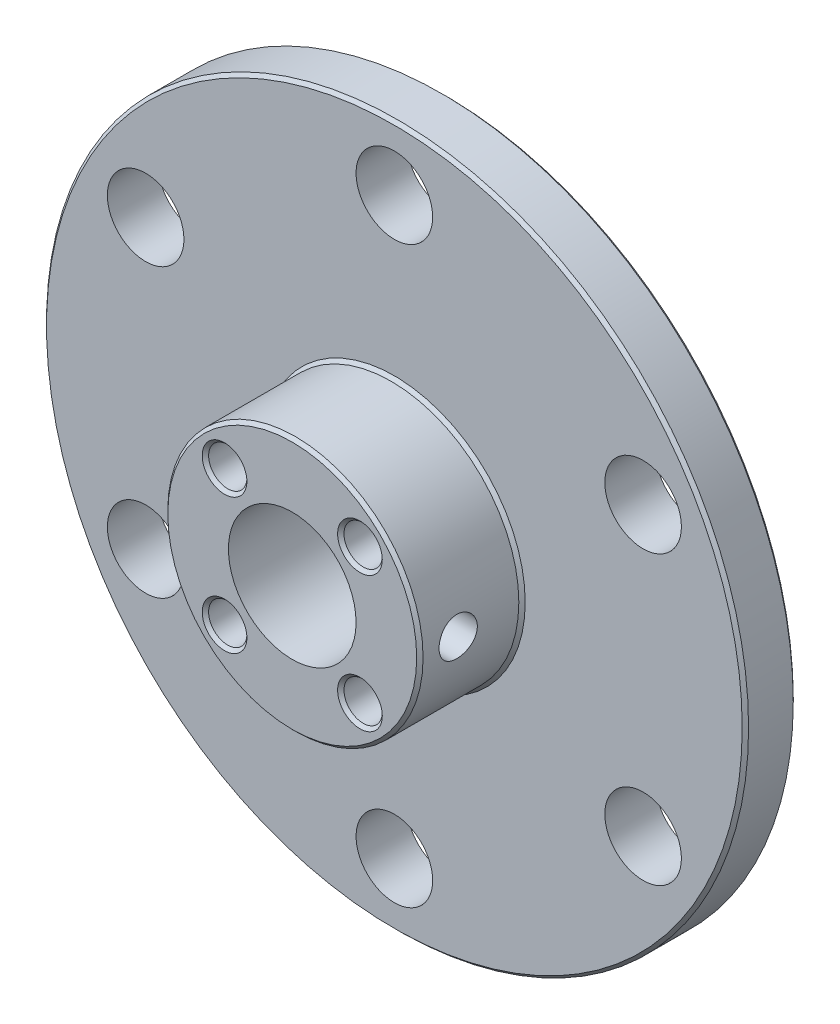
ISO-10303-21;
HEADER;
FILE_DESCRIPTION(('STEP AP214'),'2;1');
FILE_NAME('part.step','',(''),(''),'','','');
FILE_SCHEMA(('AUTOMOTIVE_DESIGN { 1 0 10303 214 1 1 1 1 }'));
ENDSEC;
DATA;
#1=APPLICATION_CONTEXT('core data for automotive mechanical design processes');
#2=APPLICATION_PROTOCOL_DEFINITION('international standard','automotive_design',2000,#1);
#3=PRODUCT_CONTEXT('',#1,'mechanical');
#4=PRODUCT('Part','Part','',(#3));
#5=PRODUCT_RELATED_PRODUCT_CATEGORY('part','',(#4));
#6=PRODUCT_DEFINITION_FORMATION('','',#4);
#7=PRODUCT_DEFINITION_CONTEXT('part definition',#1,'design');
#8=PRODUCT_DEFINITION('design','',#6,#7);
#9=PRODUCT_DEFINITION_SHAPE('','',#8);
#10=(LENGTH_UNIT() NAMED_UNIT(*) SI_UNIT(.MILLI.,.METRE.));
#11=(NAMED_UNIT(*) PLANE_ANGLE_UNIT() SI_UNIT($,.RADIAN.));
#12=(NAMED_UNIT(*) SI_UNIT($,.STERADIAN.) SOLID_ANGLE_UNIT());
#13=UNCERTAINTY_MEASURE_WITH_UNIT(LENGTH_MEASURE(1.E-05),#10,'distance_accuracy_value','');
#14=(GEOMETRIC_REPRESENTATION_CONTEXT(3) GLOBAL_UNCERTAINTY_ASSIGNED_CONTEXT((#13)) GLOBAL_UNIT_ASSIGNED_CONTEXT((#10,
#11,#12)) REPRESENTATION_CONTEXT('',''));
#15=CARTESIAN_POINT('',(0.,0.,0.));
#16=DIRECTION('',(0.,0.,1.));
#17=DIRECTION('',(1.,0.,0.));
#18=AXIS2_PLACEMENT_3D('',#15,#16,#17);
#19=CARTESIAN_POINT('',(0.,0.,12.));
#20=DIRECTION('',(0.,0.,-1.));
#21=DIRECTION('',(-1.,0.,0.));
#22=AXIS2_PLACEMENT_3D('',#19,#20,#21);
#23=CYLINDRICAL_SURFACE('',#22,10.);
#24=CARTESIAN_POINT('',(0.,0.,4.25000000000002));
#25=DIRECTION('',(0.,0.,1.));
#26=DIRECTION('',(1.,0.,0.));
#27=AXIS2_PLACEMENT_3D('',#24,#25,#26);
#28=CIRCLE('',#27,10.);
#29=CARTESIAN_POINT('',(10.,0.,4.25000000000002));
#30=VERTEX_POINT('',#29);
#31=EDGE_CURVE('E53',#30,#30,#28,.T.);
#32=ORIENTED_EDGE('',*,*,#31,.T.);
#33=EDGE_LOOP('',(#32));
#34=FACE_BOUND('',#33,.T.);
#35=CARTESIAN_POINT('',(0.,0.,11.75));
#36=DIRECTION('',(0.,0.,1.));
#37=DIRECTION('',(1.,0.,0.));
#38=AXIS2_PLACEMENT_3D('',#35,#36,#37);
#39=CIRCLE('',#38,10.);
#40=CARTESIAN_POINT('',(10.,0.,11.75));
#41=VERTEX_POINT('',#40);
#42=EDGE_CURVE('E58',#41,#41,#39,.F.);
#43=ORIENTED_EDGE('',*,*,#42,.T.);
#44=EDGE_LOOP('',(#43));
#45=FACE_BOUND('',#44,.T.);
#46=CARTESIAN_POINT('',(10.,0.,7.5));
#47=CARTESIAN_POINT('',(9.99999865771297,-0.083751544481642,7.50000345381524));
#48=CARTESIAN_POINT('',(9.9989368253704,-0.167551685082131,7.50703800084064));
#49=CARTESIAN_POINT('',(9.99480315973187,-0.332809627994913,7.53498319998275));
#50=CARTESIAN_POINT('',(9.99172936938473,-0.414265068974229,7.55590736294489));
#51=CARTESIAN_POINT('',(9.98391721219526,-0.57241808622186,7.61099250496763));
#52=CARTESIAN_POINT('',(9.97918010370919,-0.649119207826798,7.64514347950595));
#53=CARTESIAN_POINT('',(9.96856475911724,-0.795690428635253,7.72568837941686));
#54=CARTESIAN_POINT('',(9.96268668152773,-0.865561474725188,7.77208060441736));
#55=CARTESIAN_POINT('',(9.95039170991452,-0.997046719562126,7.87617726493988));
#56=CARTESIAN_POINT('',(9.94397133890331,-1.0585998322255,7.9339584562082));
#57=CARTESIAN_POINT('',(9.93134261133238,-1.17117490668948,8.05902768889387));
#58=CARTESIAN_POINT('',(9.92513426698505,-1.22219626272936,8.12631627677852));
#59=CARTESIAN_POINT('',(9.91359877458726,-1.31249729499943,8.26890064352249));
#60=CARTESIAN_POINT('',(9.90827611975031,-1.35171787037205,8.34423424698134));
#61=CARTESIAN_POINT('',(9.89916211306268,-1.41692632171056,8.50051282064543));
#62=CARTESIAN_POINT('',(9.89537067775449,-1.44291491889163,8.5814574847439));
#63=CARTESIAN_POINT('',(9.88978256218673,-1.48073198798911,8.74601804187172));
#64=CARTESIAN_POINT('',(9.8879711574125,-1.49266503640518,8.82960939340803));
#65=CARTESIAN_POINT('',(9.88650348970582,-1.50235624033932,8.99762616598728));
#66=CARTESIAN_POINT('',(9.88684710303147,-1.50011520973796,9.0820515388625));
#67=CARTESIAN_POINT('',(9.88963718352409,-1.48160733250787,9.24860108019414));
#68=CARTESIAN_POINT('',(9.89206618761549,-1.4654569592775,9.3307385264848));
#69=CARTESIAN_POINT('',(9.89872608126367,-1.41977117403734,9.49112436887153));
#70=CARTESIAN_POINT('',(9.90295702179379,-1.39023538337812,9.56937265488075));
#71=CARTESIAN_POINT('',(9.91276335545481,-1.31849603529736,9.72011337128286));
#72=CARTESIAN_POINT('',(9.91834396766526,-1.27624314283198,9.79258196909239));
#73=CARTESIAN_POINT('',(9.93021707574548,-1.18030413128955,9.92944459578193));
#74=CARTESIAN_POINT('',(9.93650961832501,-1.12661726182478,9.99383809426937));
#75=CARTESIAN_POINT('',(9.94917473056209,-1.00869493078248,10.1133976607397));
#76=CARTESIAN_POINT('',(9.95554747112815,-0.944359329642002,10.1684649902863));
#77=CARTESIAN_POINT('',(9.96759647648462,-0.807307089894186,10.2670359345073));
#78=CARTESIAN_POINT('',(9.9732727382251,-0.73459041458817,10.3105394985439));
#79=CARTESIAN_POINT('',(9.98329515585393,-0.582754598213686,10.3847530864995));
#80=CARTESIAN_POINT('',(9.98764051925428,-0.50363167783678,10.4154554918403));
#81=CARTESIAN_POINT('',(9.99450490557069,-0.341273182487061,10.4631093896854));
#82=CARTESIAN_POINT('',(9.99702405195467,-0.258037885952601,10.4800618118156));
#83=CARTESIAN_POINT('',(9.99993581133871,-0.0906695676436468,10.4996032298167));
#84=CARTESIAN_POINT('',(10.0003485209039,-0.00655273187047065,10.5023279713793));
#85=CARTESIAN_POINT('',(9.99905561015226,0.160936677662283,10.493696994689));
#86=CARTESIAN_POINT('',(9.99735005541369,0.244309274381877,10.4823417123319));
#87=CARTESIAN_POINT('',(9.99202468615333,0.407532387431408,10.4459858998225));
#88=CARTESIAN_POINT('',(9.98841415207984,0.487397963079838,10.4210515039692));
#89=CARTESIAN_POINT('',(9.97968235658369,0.641814958642999,10.3583150025382));
#90=CARTESIAN_POINT('',(9.97456102421565,0.716366128795099,10.3205122926664));
#91=CARTESIAN_POINT('',(9.96332682468686,0.85863497929192,10.2327937754361));
#92=CARTESIAN_POINT('',(9.95720701626745,0.926299009891565,10.1827918599872));
#93=CARTESIAN_POINT('',(9.94467863012165,1.0523236731777,10.0722141883713));
#94=CARTESIAN_POINT('',(9.93827003562867,1.1106837647934,10.0116378176754));
#95=CARTESIAN_POINT('',(9.92582264304494,1.21693784957195,9.88102646682351));
#96=CARTESIAN_POINT('',(9.91978736017588,1.26474084747421,9.81091707480523));
#97=CARTESIAN_POINT('',(9.90883219104903,1.34789129270584,9.66358395948823));
#98=CARTESIAN_POINT('',(9.90391227465628,1.38323907656436,9.58636042847854));
#99=CARTESIAN_POINT('',(9.89577033008645,1.44033467323943,9.42726246637687));
#100=CARTESIAN_POINT('',(9.89254233006438,1.46213037141635,9.34540553902876));
#101=CARTESIAN_POINT('',(9.88813382297802,1.49165549501586,9.1791409845649));
#102=CARTESIAN_POINT('',(9.88695317451771,1.49938589183066,9.09473353400533));
#103=CARTESIAN_POINT('',(9.88677832610841,1.5005378666944,8.92667093668422));
#104=CARTESIAN_POINT('',(9.88776226333502,1.49410252167313,8.84301675824308));
#105=CARTESIAN_POINT('',(9.89175820611174,1.46741229544379,8.67799473667649));
#106=CARTESIAN_POINT('',(9.89477020841118,1.44715743638627,8.59662688988661));
#107=CARTESIAN_POINT('',(9.90247526112297,1.39345373518665,8.43852691776568));
#108=CARTESIAN_POINT('',(9.90716703716075,1.36001489324314,8.36179132956657));
#109=CARTESIAN_POINT('',(9.91770454557702,1.28090667642309,8.2149963661976));
#110=CARTESIAN_POINT('',(9.92355031702724,1.23523688741502,8.14493721719636));
#111=CARTESIAN_POINT('',(9.93580743364938,1.13244337659164,8.01275694202483));
#112=CARTESIAN_POINT('',(9.94222367881967,1.07521369039806,7.95071866675293));
#113=CARTESIAN_POINT('',(9.95485788826636,0.951148841082834,7.83707544521218));
#114=CARTESIAN_POINT('',(9.96107580610759,0.884311448350941,7.78547292742384));
#115=CARTESIAN_POINT('',(9.9726518579052,0.742495707543722,7.69391232339264));
#116=CARTESIAN_POINT('',(9.9780050712882,0.667474576764761,7.65401989078526));
#117=CARTESIAN_POINT('',(9.98720028802959,0.51175187024872,7.58746148324196));
#118=CARTESIAN_POINT('',(9.99104385565757,0.431056277096705,7.56078180994631));
#119=CARTESIAN_POINT('',(9.99590939261505,0.29166572788933,7.52745865728989));
#120=CARTESIAN_POINT('',(9.99743549179557,0.233831133495279,7.51717739846119));
#121=CARTESIAN_POINT('',(9.99948125947896,0.117338971600125,7.50344690228736));
#122=CARTESIAN_POINT('',(10.0000009404877,0.0586814143344172,7.49999758004746));
#123=CARTESIAN_POINT('',(10.,0.,7.5));
#124=B_SPLINE_CURVE_WITH_KNOTS('',3,(#46,#47,#48,#49,#50,#51,#52,#53,#54,#55,#56,#57,#58,#59,
#60,#61,#62,#63,#64,#65,#66,#67,#68,#69,#70,#71,#72,#73,#74,#75,#76,#77,#78,#79,#80,#81,#82,#83,
#84,#85,#86,#87,#88,#89,#90,#91,#92,#93,#94,#95,#96,#97,#98,#99,#100,#101,#102,#103,#104,#105,
#106,#107,#108,#109,#110,#111,#112,#113,#114,#115,#116,#117,#118,#119,#120,#121,#122,#123),
.UNSPECIFIED.,.T.,.F.,(4,2,2,2,2,2,2,2,2,2,2,2,2,2,2,2,2,2,2,2,2,2,2,2,2,2,2,2,2,2,2,2,2,2,2,2,
2,2,4),(0.,0.251040205031663,0.50232496292915,0.753420023583236,1.0044802241976,
1.25729416136843,1.5101226357258,1.76419702395375,2.01825756225506,2.27041564605924,
2.52255925098982,2.77261177195746,3.02267136690361,3.27371383476159,3.52477278308534,
3.77834291255408,4.03191415238668,4.28563608984874,4.53934087193401,4.79062058544255,
5.04189251991155,5.29195148965948,5.54202220376273,5.79391188036907,6.04581620028629,
6.29981366584671,6.55380426808832,6.80689223457168,7.05996272137176,7.31048888261064,
7.56101464229563,7.81135073984146,8.06169531466879,8.3144482996572,8.56726003468733,
8.82146323384733,9.07540233261441,9.25129851978808,9.4271925212329),.UNSPECIFIED.);
#125=CARTESIAN_POINT('',(10.,0.,7.5));
#126=VERTEX_POINT('',#125);
#127=EDGE_CURVE('E119',#126,#126,#124,.T.);
#128=ORIENTED_EDGE('',*,*,#127,.T.);
#129=EDGE_LOOP('',(#128));
#130=FACE_BOUND('',#129,.T.);
#131=CARTESIAN_POINT('',(-10.,0.,10.5));
#132=CARTESIAN_POINT('',(-9.99999865771297,0.0837515444816421,10.4999965461848));
#133=CARTESIAN_POINT('',(-9.9989368253704,0.167551685082132,10.4929619991594));
#134=CARTESIAN_POINT('',(-9.99480315973187,0.332809627994913,10.4650168000172));
#135=CARTESIAN_POINT('',(-9.99172936938473,0.414265068974229,10.4440926370551));
#136=CARTESIAN_POINT('',(-9.98391721219526,0.572418086221859,10.3890074950324));
#137=CARTESIAN_POINT('',(-9.97918010370919,0.649119207826798,10.3548565204941));
#138=CARTESIAN_POINT('',(-9.96856475911724,0.795690428635253,10.2743116205831));
#139=CARTESIAN_POINT('',(-9.96268668152773,0.865561474725188,10.2279193955826));
#140=CARTESIAN_POINT('',(-9.95039170991452,0.997046719562126,10.1238227350601));
#141=CARTESIAN_POINT('',(-9.94397133890331,1.0585998322255,10.0660415437918));
#142=CARTESIAN_POINT('',(-9.93134261133238,1.17117490668948,9.94097231110613));
#143=CARTESIAN_POINT('',(-9.92513426698505,1.22219626272936,9.87368372322148));
#144=CARTESIAN_POINT('',(-9.91359877458726,1.31249729499943,9.73109935647751));
#145=CARTESIAN_POINT('',(-9.90827611975031,1.35171787037205,9.65576575301866));
#146=CARTESIAN_POINT('',(-9.89916211306268,1.41692632171056,9.49948717935457));
#147=CARTESIAN_POINT('',(-9.89537067775449,1.44291491889163,9.41854251525611));
#148=CARTESIAN_POINT('',(-9.88978256218673,1.48073198798911,9.25398195812828));
#149=CARTESIAN_POINT('',(-9.8879711574125,1.49266503640518,9.17039060659198));
#150=CARTESIAN_POINT('',(-9.88650348970582,1.50235624033932,9.00237383401272));
#151=CARTESIAN_POINT('',(-9.88684710303147,1.50011520973796,8.91794846113751));
#152=CARTESIAN_POINT('',(-9.88963718352409,1.48160733250787,8.75139891980586));
#153=CARTESIAN_POINT('',(-9.89206618761549,1.4654569592775,8.6692614735152));
#154=CARTESIAN_POINT('',(-9.89872608126367,1.41977117403734,8.50887563112847));
#155=CARTESIAN_POINT('',(-9.90295702179379,1.39023538337812,8.43062734511926));
#156=CARTESIAN_POINT('',(-9.91276335545481,1.31849603529736,8.27988662871714));
#157=CARTESIAN_POINT('',(-9.91834396766526,1.27624314283198,8.20741803090761));
#158=CARTESIAN_POINT('',(-9.93021707574548,1.18030413128955,8.07055540421807));
#159=CARTESIAN_POINT('',(-9.93650961832501,1.12661726182478,8.00616190573063));
#160=CARTESIAN_POINT('',(-9.94917473056209,1.00869493078248,7.88660233926029));
#161=CARTESIAN_POINT('',(-9.95554747112815,0.944359329642002,7.83153500971366));
#162=CARTESIAN_POINT('',(-9.96759647648462,0.807307089894187,7.73296406549274));
#163=CARTESIAN_POINT('',(-9.9732727382251,0.734590414588171,7.68946050145611));
#164=CARTESIAN_POINT('',(-9.98329515585393,0.582754598213686,7.61524691350046));
#165=CARTESIAN_POINT('',(-9.98764051925428,0.50363167783678,7.58454450815971));
#166=CARTESIAN_POINT('',(-9.99450490557069,0.341273182487061,7.53689061031463));
#167=CARTESIAN_POINT('',(-9.99702405195467,0.2580378859526,7.51993818818443));
#168=CARTESIAN_POINT('',(-9.99993581133871,0.0906695676436462,7.50039677018331));
#169=CARTESIAN_POINT('',(-10.0003485209039,0.00655273187047014,7.49767202862068));
#170=CARTESIAN_POINT('',(-9.99905561015226,-0.160936677662283,7.50630300531103));
#171=CARTESIAN_POINT('',(-9.99735005541369,-0.244309274381877,7.5176582876681));
#172=CARTESIAN_POINT('',(-9.99202468615333,-0.407532387431408,7.55401410017754));
#173=CARTESIAN_POINT('',(-9.98841415207984,-0.487397963079838,7.57894849603085));
#174=CARTESIAN_POINT('',(-9.97968235658369,-0.641814958642999,7.64168499746176));
#175=CARTESIAN_POINT('',(-9.97456102421565,-0.7163661287951,7.67948770733363));
#176=CARTESIAN_POINT('',(-9.96332682468686,-0.858634979291921,7.76720622456386));
#177=CARTESIAN_POINT('',(-9.95720701626745,-0.926299009891566,7.81720814001277));
#178=CARTESIAN_POINT('',(-9.94467863012165,-1.05232367317771,7.92778581162875));
#179=CARTESIAN_POINT('',(-9.93827003562867,-1.1106837647934,7.98836218232465));
#180=CARTESIAN_POINT('',(-9.92582264304494,-1.21693784957195,8.11897353317649));
#181=CARTESIAN_POINT('',(-9.91978736017588,-1.26474084747421,8.18908292519477));
#182=CARTESIAN_POINT('',(-9.90883219104903,-1.34789129270584,8.33641604051177));
#183=CARTESIAN_POINT('',(-9.90391227465628,-1.38323907656436,8.41363957152147));
#184=CARTESIAN_POINT('',(-9.89577033008645,-1.44033467323943,8.57273753362313));
#185=CARTESIAN_POINT('',(-9.89254233006438,-1.46213037141635,8.65459446097124));
#186=CARTESIAN_POINT('',(-9.88813382297802,-1.49165549501586,8.82085901543511));
#187=CARTESIAN_POINT('',(-9.88695317451771,-1.49938589183066,8.90526646599467));
#188=CARTESIAN_POINT('',(-9.88677832610841,-1.5005378666944,9.07332906331578));
#189=CARTESIAN_POINT('',(-9.88776226333502,-1.49410252167313,9.15698324175692));
#190=CARTESIAN_POINT('',(-9.89175820611174,-1.46741229544379,9.32200526332352));
#191=CARTESIAN_POINT('',(-9.89477020841118,-1.44715743638627,9.40337311011339));
#192=CARTESIAN_POINT('',(-9.90247526112297,-1.39345373518665,9.56147308223432));
#193=CARTESIAN_POINT('',(-9.90716703716075,-1.36001489324314,9.63820867043344));
#194=CARTESIAN_POINT('',(-9.91770454557702,-1.28090667642309,9.7850036338024));
#195=CARTESIAN_POINT('',(-9.92355031702724,-1.23523688741502,9.85506278280364));
#196=CARTESIAN_POINT('',(-9.93580743364938,-1.13244337659164,9.98724305797517));
#197=CARTESIAN_POINT('',(-9.94222367881967,-1.07521369039806,10.0492813332471));
#198=CARTESIAN_POINT('',(-9.95485788826636,-0.951148841082834,10.1629245547878));
#199=CARTESIAN_POINT('',(-9.96107580610759,-0.884311448350941,10.2145270725762));
#200=CARTESIAN_POINT('',(-9.9726518579052,-0.742495707543721,10.3060876766074));
#201=CARTESIAN_POINT('',(-9.9780050712882,-0.66747457676476,10.3459801092147));
#202=CARTESIAN_POINT('',(-9.98720028802959,-0.511751870248719,10.412538516758));
#203=CARTESIAN_POINT('',(-9.99104385565757,-0.431056277096705,10.4392181900537));
#204=CARTESIAN_POINT('',(-9.99590939261505,-0.29166572788933,10.4725413427101));
#205=CARTESIAN_POINT('',(-9.99743549179557,-0.233831133495279,10.4828226015388));
#206=CARTESIAN_POINT('',(-9.99948125947896,-0.117338971600125,10.4965530977126));
#207=CARTESIAN_POINT('',(-10.0000009404877,-0.0586814143344173,10.5000024199525));
#208=CARTESIAN_POINT('',(-10.,0.,10.5));
#209=B_SPLINE_CURVE_WITH_KNOTS('',3,(#131,#132,#133,#134,#135,#136,#137,#138,#139,#140,#141,
#142,#143,#144,#145,#146,#147,#148,#149,#150,#151,#152,#153,#154,#155,#156,#157,#158,#159,#160,
#161,#162,#163,#164,#165,#166,#167,#168,#169,#170,#171,#172,#173,#174,#175,#176,#177,#178,#179,
#180,#181,#182,#183,#184,#185,#186,#187,#188,#189,#190,#191,#192,#193,#194,#195,#196,#197,#198,
#199,#200,#201,#202,#203,#204,#205,#206,#207,#208),.UNSPECIFIED.,.T.,.F.,(4,2,2,2,2,2,2,2,2,2,2,
2,2,2,2,2,2,2,2,2,2,2,2,2,2,2,2,2,2,2,2,2,2,2,2,2,2,2,4),(0.,0.251040205031663,0.50232496292915,
0.753420023583236,1.0044802241976,1.25729416136843,1.5101226357258,1.76419702395375,
2.01825756225506,2.27041564605924,2.52255925098982,2.77261177195746,3.02267136690361,
3.27371383476159,3.52477278308534,3.77834291255408,4.03191415238668,4.28563608984874,
4.53934087193401,4.79062058544255,5.04189251991155,5.29195148965948,5.54202220376273,
5.79391188036907,6.04581620028629,6.29981366584672,6.55380426808832,6.80689223457168,
7.05996272137176,7.31048888261064,7.56101464229564,7.81135073984146,8.06169531466879,
8.3144482996572,8.56726003468733,8.82146323384733,9.07540233261441,9.25129851978808,
9.4271925212329),.UNSPECIFIED.);
#210=CARTESIAN_POINT('',(-10.,0.,10.5));
#211=VERTEX_POINT('',#210);
#212=EDGE_CURVE('E106',#211,#211,#209,.T.);
#213=ORIENTED_EDGE('',*,*,#212,.F.);
#214=EDGE_LOOP('',(#213));
#215=FACE_BOUND('',#214,.T.);
#216=ADVANCED_FACE('F37',(#34,#45,#130,#215),#23,.T.);
#217=CARTESIAN_POINT('',(0.,0.,4.));
#218=DIRECTION('',(0.,0.,1.));
#219=DIRECTION('',(1.,0.,0.));
#220=AXIS2_PLACEMENT_3D('',#217,#218,#219);
#221=PLANE('',#220);
#222=CARTESIAN_POINT('',(0.,0.,4.));
#223=DIRECTION('',(0.,0.,1.));
#224=DIRECTION('',(1.,0.,0.));
#225=AXIS2_PLACEMENT_3D('',#222,#223,#224);
#226=CIRCLE('',#225,10.25);
#227=CARTESIAN_POINT('',(10.25,0.,4.));
#228=VERTEX_POINT('',#227);
#229=EDGE_CURVE('E45',#228,#228,#226,.F.);
#230=ORIENTED_EDGE('',*,*,#229,.T.);
#231=EDGE_LOOP('',(#230));
#232=FACE_BOUND('',#231,.T.);
#233=CARTESIAN_POINT('',(0.,0.,4.));
#234=DIRECTION('',(0.,0.,1.));
#235=DIRECTION('',(1.,0.,0.));
#236=AXIS2_PLACEMENT_3D('',#233,#234,#235);
#237=CIRCLE('',#236,27.25);
#238=CARTESIAN_POINT('',(27.25,0.,4.));
#239=VERTEX_POINT('',#238);
#240=EDGE_CURVE('E49',#239,#239,#237,.T.);
#241=ORIENTED_EDGE('',*,*,#240,.T.);
#242=EDGE_LOOP('',(#241));
#243=FACE_BOUND('',#242,.T.);
#244=CARTESIAN_POINT('',(-19.4855715851484,-11.2500000000008,4.));
#245=DIRECTION('',(0.,0.,1.));
#246=DIRECTION('',(1.,0.,0.));
#247=AXIS2_PLACEMENT_3D('',#244,#245,#246);
#248=CIRCLE('',#247,3.00000000000182);
#249=CARTESIAN_POINT('',(-16.4855715851466,-11.2500000000008,4.));
#250=VERTEX_POINT('',#249);
#251=EDGE_CURVE('E234',#250,#250,#248,.T.);
#252=ORIENTED_EDGE('',*,*,#251,.F.);
#253=EDGE_LOOP('',(#252));
#254=FACE_BOUND('',#253,.T.);
#255=CARTESIAN_POINT('',(19.4855715851513,-11.2499999999992,4.));
#256=DIRECTION('',(0.,0.,1.));
#257=DIRECTION('',(1.,0.,0.));
#258=AXIS2_PLACEMENT_3D('',#255,#256,#257);
#259=CIRCLE('',#258,3.00000000000123);
#260=CARTESIAN_POINT('',(22.4855715851525,-11.2499999999992,4.));
#261=VERTEX_POINT('',#260);
#262=EDGE_CURVE('E222',#261,#261,#259,.T.);
#263=ORIENTED_EDGE('',*,*,#262,.F.);
#264=EDGE_LOOP('',(#263));
#265=FACE_BOUND('',#264,.T.);
#266=CARTESIAN_POINT('',(0.,22.5,4.));
#267=DIRECTION('',(0.,0.,1.));
#268=DIRECTION('',(1.,0.,0.));
#269=AXIS2_PLACEMENT_3D('',#266,#267,#268);
#270=CIRCLE('',#269,3.);
#271=CARTESIAN_POINT('',(3.,22.5,4.));
#272=VERTEX_POINT('',#271);
#273=EDGE_CURVE('E210',#272,#272,#270,.T.);
#274=ORIENTED_EDGE('',*,*,#273,.F.);
#275=EDGE_LOOP('',(#274));
#276=FACE_BOUND('',#275,.T.);
#277=CARTESIAN_POINT('',(19.4855715851503,11.2500000000008,4.));
#278=DIRECTION('',(0.,0.,1.));
#279=DIRECTION('',(1.,0.,0.));
#280=AXIS2_PLACEMENT_3D('',#277,#278,#279);
#281=CIRCLE('',#280,3.00000000000027);
#282=CARTESIAN_POINT('',(22.4855715851506,11.2500000000008,4.));
#283=VERTEX_POINT('',#282);
#284=EDGE_CURVE('E217',#283,#283,#281,.T.);
#285=ORIENTED_EDGE('',*,*,#284,.F.);
#286=EDGE_LOOP('',(#285));
#287=FACE_BOUND('',#286,.T.);
#288=CARTESIAN_POINT('',(1.91019902065803E-12,-22.5,4.));
#289=DIRECTION('',(0.,0.,1.));
#290=DIRECTION('',(1.,0.,0.));
#291=AXIS2_PLACEMENT_3D('',#288,#289,#290);
#292=CIRCLE('',#291,3.00000000000198);
#293=CARTESIAN_POINT('',(3.00000000000389,-22.5,4.));
#294=VERTEX_POINT('',#293);
#295=EDGE_CURVE('E228',#294,#294,#292,.T.);
#296=ORIENTED_EDGE('',*,*,#295,.F.);
#297=EDGE_LOOP('',(#296));
#298=FACE_BOUND('',#297,.T.);
#299=CARTESIAN_POINT('',(-19.4855715851494,11.2499999999992,4.));
#300=DIRECTION('',(0.,0.,1.));
#301=DIRECTION('',(1.,0.,0.));
#302=AXIS2_PLACEMENT_3D('',#299,#300,#301);
#303=CIRCLE('',#302,3.00000000000097);
#304=CARTESIAN_POINT('',(-16.4855715851484,11.2499999999992,4.));
#305=VERTEX_POINT('',#304);
#306=EDGE_CURVE('E240',#305,#305,#303,.T.);
#307=ORIENTED_EDGE('',*,*,#306,.F.);
#308=EDGE_LOOP('',(#307));
#309=FACE_BOUND('',#308,.T.);
#310=ADVANCED_FACE('F193',(#232,#243,#254,#265,#276,#287,#298,#309),#221,.T.);
#311=CARTESIAN_POINT('',(0.,0.,0.));
#312=DIRECTION('',(0.,0.,1.));
#313=DIRECTION('',(1.,0.,0.));
#314=AXIS2_PLACEMENT_3D('',#311,#312,#313);
#315=PLANE('',#314);
#316=CARTESIAN_POINT('',(0.,0.,0.));
#317=DIRECTION('',(0.,0.,1.));
#318=DIRECTION('',(1.,0.,0.));
#319=AXIS2_PLACEMENT_3D('',#316,#317,#318);
#320=CIRCLE('',#319,15.25);
#321=CARTESIAN_POINT('',(15.25,0.,0.));
#322=VERTEX_POINT('',#321);
#323=EDGE_CURVE('E67',#322,#322,#320,.T.);
#324=ORIENTED_EDGE('',*,*,#323,.T.);
#325=EDGE_LOOP('',(#324));
#326=FACE_BOUND('',#325,.T.);
#327=CARTESIAN_POINT('',(0.,0.,0.));
#328=DIRECTION('',(0.,0.,1.));
#329=DIRECTION('',(1.,0.,0.));
#330=AXIS2_PLACEMENT_3D('',#327,#328,#329);
#331=CIRCLE('',#330,27.25);
#332=CARTESIAN_POINT('',(27.25,0.,0.));
#333=VERTEX_POINT('',#332);
#334=EDGE_CURVE('E70',#333,#333,#331,.F.);
#335=ORIENTED_EDGE('',*,*,#334,.T.);
#336=EDGE_LOOP('',(#335));
#337=FACE_BOUND('',#336,.T.);
#338=CARTESIAN_POINT('',(0.,22.5,0.));
#339=DIRECTION('',(0.,0.,1.));
#340=DIRECTION('',(1.,0.,0.));
#341=AXIS2_PLACEMENT_3D('',#338,#339,#340);
#342=CIRCLE('',#341,3.);
#343=CARTESIAN_POINT('',(3.,22.5,0.));
#344=VERTEX_POINT('',#343);
#345=EDGE_CURVE('E212',#344,#344,#342,.T.);
#346=ORIENTED_EDGE('',*,*,#345,.T.);
#347=EDGE_LOOP('',(#346));
#348=FACE_BOUND('',#347,.T.);
#349=CARTESIAN_POINT('',(19.4855715851503,11.2500000000008,0.));
#350=DIRECTION('',(0.,0.,1.));
#351=DIRECTION('',(1.,0.,0.));
#352=AXIS2_PLACEMENT_3D('',#349,#350,#351);
#353=CIRCLE('',#352,3.00000000000027);
#354=CARTESIAN_POINT('',(22.4855715851506,11.2500000000008,0.));
#355=VERTEX_POINT('',#354);
#356=EDGE_CURVE('E219',#355,#355,#353,.T.);
#357=ORIENTED_EDGE('',*,*,#356,.T.);
#358=EDGE_LOOP('',(#357));
#359=FACE_BOUND('',#358,.T.);
#360=CARTESIAN_POINT('',(19.4855715851513,-11.2499999999992,0.));
#361=DIRECTION('',(0.,0.,1.));
#362=DIRECTION('',(1.,0.,0.));
#363=AXIS2_PLACEMENT_3D('',#360,#361,#362);
#364=CIRCLE('',#363,3.00000000000123);
#365=CARTESIAN_POINT('',(22.4855715851525,-11.2499999999992,0.));
#366=VERTEX_POINT('',#365);
#367=EDGE_CURVE('E225',#366,#366,#364,.T.);
#368=ORIENTED_EDGE('',*,*,#367,.T.);
#369=EDGE_LOOP('',(#368));
#370=FACE_BOUND('',#369,.T.);
#371=CARTESIAN_POINT('',(1.91019902065803E-12,-22.5,0.));
#372=DIRECTION('',(0.,0.,1.));
#373=DIRECTION('',(1.,0.,0.));
#374=AXIS2_PLACEMENT_3D('',#371,#372,#373);
#375=CIRCLE('',#374,3.00000000000198);
#376=CARTESIAN_POINT('',(3.00000000000389,-22.5,0.));
#377=VERTEX_POINT('',#376);
#378=EDGE_CURVE('E231',#377,#377,#375,.T.);
#379=ORIENTED_EDGE('',*,*,#378,.T.);
#380=EDGE_LOOP('',(#379));
#381=FACE_BOUND('',#380,.T.);
#382=CARTESIAN_POINT('',(-19.4855715851484,-11.2500000000008,0.));
#383=DIRECTION('',(0.,0.,1.));
#384=DIRECTION('',(1.,0.,0.));
#385=AXIS2_PLACEMENT_3D('',#382,#383,#384);
#386=CIRCLE('',#385,3.00000000000182);
#387=CARTESIAN_POINT('',(-16.4855715851466,-11.2500000000008,0.));
#388=VERTEX_POINT('',#387);
#389=EDGE_CURVE('E237',#388,#388,#386,.T.);
#390=ORIENTED_EDGE('',*,*,#389,.T.);
#391=EDGE_LOOP('',(#390));
#392=FACE_BOUND('',#391,.T.);
#393=CARTESIAN_POINT('',(-19.4855715851494,11.2499999999992,0.));
#394=DIRECTION('',(0.,0.,1.));
#395=DIRECTION('',(1.,0.,0.));
#396=AXIS2_PLACEMENT_3D('',#393,#394,#395);
#397=CIRCLE('',#396,3.00000000000097);
#398=CARTESIAN_POINT('',(-16.4855715851484,11.2499999999992,0.));
#399=VERTEX_POINT('',#398);
#400=EDGE_CURVE('E243',#399,#399,#397,.T.);
#401=ORIENTED_EDGE('',*,*,#400,.T.);
#402=EDGE_LOOP('',(#401));
#403=FACE_BOUND('',#402,.T.);
#404=ADVANCED_FACE('F198',(#326,#337,#348,#359,#370,#381,#392,#403),#315,.F.);
#405=CARTESIAN_POINT('',(0.,0.,4.));
#406=DIRECTION('',(0.,0.,-1.));
#407=DIRECTION('',(-1.,0.,0.));
#408=AXIS2_PLACEMENT_3D('',#405,#406,#407);
#409=CYLINDRICAL_SURFACE('',#408,27.5);
#410=CARTESIAN_POINT('',(0.,0.,0.24999999999999));
#411=DIRECTION('',(0.,0.,1.));
#412=DIRECTION('',(1.,0.,0.));
#413=AXIS2_PLACEMENT_3D('',#410,#411,#412);
#414=CIRCLE('',#413,27.5);
#415=CARTESIAN_POINT('',(27.5,0.,0.24999999999999));
#416=VERTEX_POINT('',#415);
#417=EDGE_CURVE('E61',#416,#416,#414,.T.);
#418=ORIENTED_EDGE('',*,*,#417,.T.);
#419=EDGE_LOOP('',(#418));
#420=FACE_BOUND('',#419,.T.);
#421=CARTESIAN_POINT('',(0.,0.,3.75));
#422=DIRECTION('',(0.,0.,1.));
#423=DIRECTION('',(1.,0.,0.));
#424=AXIS2_PLACEMENT_3D('',#421,#422,#423);
#425=CIRCLE('',#424,27.5);
#426=CARTESIAN_POINT('',(27.5,0.,3.75));
#427=VERTEX_POINT('',#426);
#428=EDGE_CURVE('E64',#427,#427,#425,.F.);
#429=ORIENTED_EDGE('',*,*,#428,.T.);
#430=EDGE_LOOP('',(#429));
#431=FACE_BOUND('',#430,.T.);
#432=ADVANCED_FACE('F372',(#420,#431),#409,.T.);
#433=CARTESIAN_POINT('',(0.,22.5,4.));
#434=DIRECTION('',(0.,0.,-1.));
#435=DIRECTION('',(-1.,0.,0.));
#436=AXIS2_PLACEMENT_3D('',#433,#434,#435);
#437=CYLINDRICAL_SURFACE('',#436,3.);
#438=ORIENTED_EDGE('',*,*,#273,.T.);
#439=EDGE_LOOP('',(#438));
#440=FACE_BOUND('',#439,.T.);
#441=ORIENTED_EDGE('',*,*,#345,.F.);
#442=EDGE_LOOP('',(#441));
#443=FACE_BOUND('',#442,.T.);
#444=ADVANCED_FACE('F377',(#440,#443),#437,.F.);
#445=CARTESIAN_POINT('',(19.4855715851503,11.2500000000008,4.));
#446=DIRECTION('',(0.,0.,-1.));
#447=DIRECTION('',(-1.,0.,0.));
#448=AXIS2_PLACEMENT_3D('',#445,#446,#447);
#449=CYLINDRICAL_SURFACE('',#448,3.00000000000027);
#450=ORIENTED_EDGE('',*,*,#284,.T.);
#451=EDGE_LOOP('',(#450));
#452=FACE_BOUND('',#451,.T.);
#453=ORIENTED_EDGE('',*,*,#356,.F.);
#454=EDGE_LOOP('',(#453));
#455=FACE_BOUND('',#454,.T.);
#456=ADVANCED_FACE('F552',(#452,#455),#449,.F.);
#457=CARTESIAN_POINT('',(19.4855715851513,-11.2499999999992,4.));
#458=DIRECTION('',(0.,0.,-1.));
#459=DIRECTION('',(-1.,0.,0.));
#460=AXIS2_PLACEMENT_3D('',#457,#458,#459);
#461=CYLINDRICAL_SURFACE('',#460,3.00000000000123);
#462=ORIENTED_EDGE('',*,*,#262,.T.);
#463=EDGE_LOOP('',(#462));
#464=FACE_BOUND('',#463,.T.);
#465=ORIENTED_EDGE('',*,*,#367,.F.);
#466=EDGE_LOOP('',(#465));
#467=FACE_BOUND('',#466,.T.);
#468=ADVANCED_FACE('F542',(#464,#467),#461,.F.);
#469=CARTESIAN_POINT('',(1.91019902065803E-12,-22.5,4.));
#470=DIRECTION('',(0.,0.,-1.));
#471=DIRECTION('',(-1.,0.,0.));
#472=AXIS2_PLACEMENT_3D('',#469,#470,#471);
#473=CYLINDRICAL_SURFACE('',#472,3.00000000000198);
#474=ORIENTED_EDGE('',*,*,#295,.T.);
#475=EDGE_LOOP('',(#474));
#476=FACE_BOUND('',#475,.T.);
#477=ORIENTED_EDGE('',*,*,#378,.F.);
#478=EDGE_LOOP('',(#477));
#479=FACE_BOUND('',#478,.T.);
#480=ADVANCED_FACE('F532',(#476,#479),#473,.F.);
#481=CARTESIAN_POINT('',(-19.4855715851484,-11.2500000000008,4.));
#482=DIRECTION('',(0.,0.,-1.));
#483=DIRECTION('',(-1.,0.,0.));
#484=AXIS2_PLACEMENT_3D('',#481,#482,#483);
#485=CYLINDRICAL_SURFACE('',#484,3.00000000000182);
#486=ORIENTED_EDGE('',*,*,#251,.T.);
#487=EDGE_LOOP('',(#486));
#488=FACE_BOUND('',#487,.T.);
#489=ORIENTED_EDGE('',*,*,#389,.F.);
#490=EDGE_LOOP('',(#489));
#491=FACE_BOUND('',#490,.T.);
#492=ADVANCED_FACE('F189',(#488,#491),#485,.F.);
#493=CARTESIAN_POINT('',(-19.4855715851494,11.2499999999992,4.));
#494=DIRECTION('',(0.,0.,-1.));
#495=DIRECTION('',(-1.,0.,0.));
#496=AXIS2_PLACEMENT_3D('',#493,#494,#495);
#497=CYLINDRICAL_SURFACE('',#496,3.00000000000097);
#498=ORIENTED_EDGE('',*,*,#306,.T.);
#499=EDGE_LOOP('',(#498));
#500=FACE_BOUND('',#499,.T.);
#501=ORIENTED_EDGE('',*,*,#400,.F.);
#502=EDGE_LOOP('',(#501));
#503=FACE_BOUND('',#502,.T.);
#504=ADVANCED_FACE('F185',(#500,#503),#497,.F.);
#505=CARTESIAN_POINT('',(0.,0.,12.));
#506=DIRECTION('',(0.,0.,1.));
#507=DIRECTION('',(1.,0.,0.));
#508=AXIS2_PLACEMENT_3D('',#505,#506,#507);
#509=PLANE('',#508);
#510=CARTESIAN_POINT('',(0.,0.,12.));
#511=DIRECTION('',(0.,0.,1.));
#512=DIRECTION('',(1.,0.,0.));
#513=AXIS2_PLACEMENT_3D('',#510,#511,#512);
#514=CIRCLE('',#513,9.75000000000001);
#515=CARTESIAN_POINT('',(9.75000000000001,0.,12.));
#516=VERTEX_POINT('',#515);
#517=EDGE_CURVE('E10',#516,#516,#514,.T.);
#518=ORIENTED_EDGE('',*,*,#517,.T.);
#519=EDGE_LOOP('',(#518));
#520=FACE_BOUND('',#519,.T.);
#521=CARTESIAN_POINT('',(5.3033008588991,5.30330085889941,12.));
#522=DIRECTION('',(0.,0.,1.));
#523=DIRECTION('',(1.,0.,0.));
#524=AXIS2_PLACEMENT_3D('',#521,#522,#523);
#525=CIRCLE('',#524,1.75000000000031);
#526=CARTESIAN_POINT('',(7.0533008588994,5.30330085889941,12.));
#527=VERTEX_POINT('',#526);
#528=EDGE_CURVE('E91',#527,#527,#525,.F.);
#529=ORIENTED_EDGE('',*,*,#528,.T.);
#530=EDGE_LOOP('',(#529));
#531=FACE_BOUND('',#530,.T.);
#532=CARTESIAN_POINT('',(-5.30330085889912,5.3033008588991,12.));
#533=DIRECTION('',(0.,0.,1.));
#534=DIRECTION('',(1.,0.,0.));
#535=AXIS2_PLACEMENT_3D('',#532,#533,#534);
#536=CIRCLE('',#535,1.74999999999999);
#537=CARTESIAN_POINT('',(-3.55330085889912,5.3033008588991,12.));
#538=VERTEX_POINT('',#537);
#539=EDGE_CURVE('E94',#538,#538,#536,.F.);
#540=ORIENTED_EDGE('',*,*,#539,.T.);
#541=EDGE_LOOP('',(#540));
#542=FACE_BOUND('',#541,.T.);
#543=CARTESIAN_POINT('',(-5.3033008588988,-5.30330085889912,12.));
#544=DIRECTION('',(0.,0.,1.));
#545=DIRECTION('',(1.,0.,0.));
#546=AXIS2_PLACEMENT_3D('',#543,#544,#545);
#547=CIRCLE('',#546,1.75000000000015);
#548=CARTESIAN_POINT('',(-3.55330085889864,-5.30330085889912,12.));
#549=VERTEX_POINT('',#548);
#550=EDGE_CURVE('E97',#549,#549,#547,.F.);
#551=ORIENTED_EDGE('',*,*,#550,.T.);
#552=EDGE_LOOP('',(#551));
#553=FACE_BOUND('',#552,.T.);
#554=CARTESIAN_POINT('',(5.30330085889942,-5.3033008588988,12.));
#555=DIRECTION('',(0.,0.,1.));
#556=DIRECTION('',(1.,0.,0.));
#557=AXIS2_PLACEMENT_3D('',#554,#555,#556);
#558=CIRCLE('',#557,1.75000000000042);
#559=CARTESIAN_POINT('',(7.05330085889983,-5.3033008588988,12.));
#560=VERTEX_POINT('',#559);
#561=EDGE_CURVE('E100',#560,#560,#558,.F.);
#562=ORIENTED_EDGE('',*,*,#561,.T.);
#563=EDGE_LOOP('',(#562));
#564=FACE_BOUND('',#563,.T.);
#565=CARTESIAN_POINT('',(0.,0.,12.));
#566=DIRECTION('',(0.,0.,1.));
#567=DIRECTION('',(1.,0.,0.));
#568=AXIS2_PLACEMENT_3D('',#565,#566,#567);
#569=CIRCLE('',#568,5.);
#570=CARTESIAN_POINT('',(5.,0.,12.));
#571=VERTEX_POINT('',#570);
#572=EDGE_CURVE('E110',#571,#571,#569,.T.);
#573=ORIENTED_EDGE('',*,*,#572,.F.);
#574=EDGE_LOOP('',(#573));
#575=FACE_BOUND('',#574,.T.);
#576=ADVANCED_FACE('F182',(#520,#531,#542,#553,#564,#575),#509,.T.);
#577=CARTESIAN_POINT('',(0.,0.,-1.5));
#578=DIRECTION('',(0.,0.,1.));
#579=DIRECTION('',(1.,0.,0.));
#580=AXIS2_PLACEMENT_3D('',#577,#578,#579);
#581=CYLINDRICAL_SURFACE('',#580,15.);
#582=CARTESIAN_POINT('',(0.,0.,-1.25));
#583=DIRECTION('',(0.,0.,-1.));
#584=DIRECTION('',(-1.,0.,0.));
#585=AXIS2_PLACEMENT_3D('',#582,#583,#584);
#586=CIRCLE('',#585,15.);
#587=CARTESIAN_POINT('',(-15.,0.,-1.25));
#588=VERTEX_POINT('',#587);
#589=EDGE_CURVE('E73',#588,#588,#586,.F.);
#590=ORIENTED_EDGE('',*,*,#589,.T.);
#591=EDGE_LOOP('',(#590));
#592=FACE_BOUND('',#591,.T.);
#593=CARTESIAN_POINT('',(0.,0.,-0.249999999999983));
#594=DIRECTION('',(0.,0.,1.));
#595=DIRECTION('',(1.,0.,0.));
#596=AXIS2_PLACEMENT_3D('',#593,#594,#595);
#597=CIRCLE('',#596,15.);
#598=CARTESIAN_POINT('',(15.,0.,-0.249999999999983));
#599=VERTEX_POINT('',#598);
#600=EDGE_CURVE('E76',#599,#599,#597,.F.);
#601=ORIENTED_EDGE('',*,*,#600,.T.);
#602=EDGE_LOOP('',(#601));
#603=FACE_BOUND('',#602,.T.);
#604=ADVANCED_FACE('F179',(#592,#603),#581,.T.);
#605=CARTESIAN_POINT('',(0.,0.,-1.5));
#606=DIRECTION('',(0.,0.,-1.));
#607=DIRECTION('',(-1.,0.,0.));
#608=AXIS2_PLACEMENT_3D('',#605,#606,#607);
#609=PLANE('',#608);
#610=CARTESIAN_POINT('',(0.,0.,-1.5));
#611=DIRECTION('',(0.,0.,-1.));
#612=DIRECTION('',(-1.,0.,0.));
#613=AXIS2_PLACEMENT_3D('',#610,#611,#612);
#614=CIRCLE('',#613,14.75);
#615=CARTESIAN_POINT('',(-14.75,0.,-1.5));
#616=VERTEX_POINT('',#615);
#617=EDGE_CURVE('E79',#616,#616,#614,.T.);
#618=ORIENTED_EDGE('',*,*,#617,.T.);
#619=EDGE_LOOP('',(#618));
#620=FACE_BOUND('',#619,.T.);
#621=CARTESIAN_POINT('',(0.,0.,-1.5));
#622=DIRECTION('',(0.,0.,-1.));
#623=DIRECTION('',(-1.,0.,0.));
#624=AXIS2_PLACEMENT_3D('',#621,#622,#623);
#625=CIRCLE('',#624,4.);
#626=CARTESIAN_POINT('',(-4.,0.,-1.5));
#627=VERTEX_POINT('',#626);
#628=EDGE_CURVE('E111',#627,#627,#625,.T.);
#629=ORIENTED_EDGE('',*,*,#628,.F.);
#630=EDGE_LOOP('',(#629));
#631=FACE_BOUND('',#630,.T.);
#632=ADVANCED_FACE('F175',(#620,#631),#609,.T.);
#633=CARTESIAN_POINT('',(-5.30330085889912,5.3033008588991,6.));
#634=DIRECTION('',(0.,0.,1.));
#635=DIRECTION('',(1.,0.,0.));
#636=AXIS2_PLACEMENT_3D('',#633,#634,#635);
#637=CYLINDRICAL_SURFACE('',#636,1.5);
#638=CARTESIAN_POINT('',(-5.30330085889912,5.3033008588991,11.75));
#639=DIRECTION('',(0.,0.,1.));
#640=DIRECTION('',(1.,0.,0.));
#641=AXIS2_PLACEMENT_3D('',#638,#639,#640);
#642=CIRCLE('',#641,1.5);
#643=CARTESIAN_POINT('',(-3.80330085889912,5.3033008588991,11.75));
#644=VERTEX_POINT('',#643);
#645=EDGE_CURVE('E88',#644,#644,#642,.T.);
#646=ORIENTED_EDGE('',*,*,#645,.T.);
#647=EDGE_LOOP('',(#646));
#648=FACE_BOUND('',#647,.T.);
#649=CARTESIAN_POINT('',(-5.30330085889912,5.3033008588991,6.));
#650=DIRECTION('',(0.,0.,1.));
#651=DIRECTION('',(1.,0.,0.));
#652=AXIS2_PLACEMENT_3D('',#649,#650,#651);
#653=CIRCLE('',#652,1.5);
#654=CARTESIAN_POINT('',(-3.80330085889912,5.3033008588991,6.));
#655=VERTEX_POINT('',#654);
#656=EDGE_CURVE('E246',#655,#655,#653,.T.);
#657=ORIENTED_EDGE('',*,*,#656,.F.);
#658=EDGE_LOOP('',(#657));
#659=FACE_BOUND('',#658,.T.);
#660=ADVANCED_FACE('F171',(#648,#659),#637,.F.);
#661=CARTESIAN_POINT('',(-5.30330085889912,5.3033008588991,6.));
#662=DIRECTION('',(0.,0.,1.));
#663=DIRECTION('',(1.,0.,0.));
#664=AXIS2_PLACEMENT_3D('',#661,#662,#663);
#665=PLANE('',#664);
#666=ORIENTED_EDGE('',*,*,#656,.T.);
#667=EDGE_LOOP('',(#666));
#668=FACE_BOUND('',#667,.T.);
#669=ADVANCED_FACE('F149',(#668),#665,.T.);
#670=CARTESIAN_POINT('',(5.3033008588991,5.30330085889941,6.));
#671=DIRECTION('',(0.,0.,1.));
#672=DIRECTION('',(1.,0.,0.));
#673=AXIS2_PLACEMENT_3D('',#670,#671,#672);
#674=CYLINDRICAL_SURFACE('',#673,1.50000000000031);
#675=CARTESIAN_POINT('',(5.3033008588991,5.30330085889941,11.75));
#676=DIRECTION('',(0.,0.,1.));
#677=DIRECTION('',(1.,0.,0.));
#678=AXIS2_PLACEMENT_3D('',#675,#676,#677);
#679=CIRCLE('',#678,1.50000000000031);
#680=CARTESIAN_POINT('',(6.80330085889941,5.30330085889941,11.75));
#681=VERTEX_POINT('',#680);
#682=EDGE_CURVE('E103',#681,#681,#679,.T.);
#683=ORIENTED_EDGE('',*,*,#682,.T.);
#684=EDGE_LOOP('',(#683));
#685=FACE_BOUND('',#684,.T.);
#686=CARTESIAN_POINT('',(5.3033008588991,5.30330085889941,6.));
#687=DIRECTION('',(0.,0.,1.));
#688=DIRECTION('',(1.,0.,0.));
#689=AXIS2_PLACEMENT_3D('',#686,#687,#688);
#690=CIRCLE('',#689,1.50000000000031);
#691=CARTESIAN_POINT('',(6.80330085889941,5.30330085889941,6.));
#692=VERTEX_POINT('',#691);
#693=EDGE_CURVE('E251',#692,#692,#690,.T.);
#694=ORIENTED_EDGE('',*,*,#693,.F.);
#695=EDGE_LOOP('',(#694));
#696=FACE_BOUND('',#695,.T.);
#697=ADVANCED_FACE('F145',(#685,#696),#674,.F.);
#698=CARTESIAN_POINT('',(5.3033008588991,5.30330085889941,6.));
#699=DIRECTION('',(0.,0.,1.));
#700=DIRECTION('',(1.,0.,0.));
#701=AXIS2_PLACEMENT_3D('',#698,#699,#700);
#702=PLANE('',#701);
#703=ORIENTED_EDGE('',*,*,#693,.T.);
#704=EDGE_LOOP('',(#703));
#705=FACE_BOUND('',#704,.T.);
#706=ADVANCED_FACE('F148',(#705),#702,.T.);
#707=CARTESIAN_POINT('',(5.30330085889942,-5.3033008588988,6.));
#708=DIRECTION('',(0.,0.,1.));
#709=DIRECTION('',(1.,0.,0.));
#710=AXIS2_PLACEMENT_3D('',#707,#708,#709);
#711=CYLINDRICAL_SURFACE('',#710,1.50000000000042);
#712=CARTESIAN_POINT('',(5.30330085889942,-5.3033008588988,11.75));
#713=DIRECTION('',(0.,0.,1.));
#714=DIRECTION('',(1.,0.,0.));
#715=AXIS2_PLACEMENT_3D('',#712,#713,#714);
#716=CIRCLE('',#715,1.50000000000042);
#717=CARTESIAN_POINT('',(6.80330085889984,-5.3033008588988,11.75));
#718=VERTEX_POINT('',#717);
#719=EDGE_CURVE('E82',#718,#718,#716,.T.);
#720=ORIENTED_EDGE('',*,*,#719,.T.);
#721=EDGE_LOOP('',(#720));
#722=FACE_BOUND('',#721,.T.);
#723=CARTESIAN_POINT('',(5.30330085889942,-5.3033008588988,6.));
#724=DIRECTION('',(0.,0.,1.));
#725=DIRECTION('',(1.,0.,0.));
#726=AXIS2_PLACEMENT_3D('',#723,#724,#725);
#727=CIRCLE('',#726,1.50000000000042);
#728=CARTESIAN_POINT('',(6.80330085889984,-5.3033008588988,6.));
#729=VERTEX_POINT('',#728);
#730=EDGE_CURVE('E255',#729,#729,#727,.T.);
#731=ORIENTED_EDGE('',*,*,#730,.F.);
#732=EDGE_LOOP('',(#731));
#733=FACE_BOUND('',#732,.T.);
#734=ADVANCED_FACE('F153',(#722,#733),#711,.F.);
#735=CARTESIAN_POINT('',(5.30330085889942,-5.3033008588988,6.));
#736=DIRECTION('',(0.,0.,1.));
#737=DIRECTION('',(1.,0.,0.));
#738=AXIS2_PLACEMENT_3D('',#735,#736,#737);
#739=PLANE('',#738);
#740=ORIENTED_EDGE('',*,*,#730,.T.);
#741=EDGE_LOOP('',(#740));
#742=FACE_BOUND('',#741,.T.);
#743=ADVANCED_FACE('F157',(#742),#739,.T.);
#744=CARTESIAN_POINT('',(-5.3033008588988,-5.30330085889912,6.));
#745=DIRECTION('',(0.,0.,1.));
#746=DIRECTION('',(1.,0.,0.));
#747=AXIS2_PLACEMENT_3D('',#744,#745,#746);
#748=CYLINDRICAL_SURFACE('',#747,1.50000000000016);
#749=CARTESIAN_POINT('',(-5.3033008588988,-5.30330085889912,11.75));
#750=DIRECTION('',(0.,0.,1.));
#751=DIRECTION('',(1.,0.,0.));
#752=AXIS2_PLACEMENT_3D('',#749,#750,#751);
#753=CIRCLE('',#752,1.50000000000016);
#754=CARTESIAN_POINT('',(-3.80330085889864,-5.30330085889912,11.75));
#755=VERTEX_POINT('',#754);
#756=EDGE_CURVE('E85',#755,#755,#753,.T.);
#757=ORIENTED_EDGE('',*,*,#756,.T.);
#758=EDGE_LOOP('',(#757));
#759=FACE_BOUND('',#758,.T.);
#760=CARTESIAN_POINT('',(-5.3033008588988,-5.30330085889912,6.));
#761=DIRECTION('',(0.,0.,1.));
#762=DIRECTION('',(1.,0.,0.));
#763=AXIS2_PLACEMENT_3D('',#760,#761,#762);
#764=CIRCLE('',#763,1.50000000000016);
#765=CARTESIAN_POINT('',(-3.80330085889864,-5.30330085889912,6.));
#766=VERTEX_POINT('',#765);
#767=EDGE_CURVE('E252',#766,#766,#764,.T.);
#768=ORIENTED_EDGE('',*,*,#767,.F.);
#769=EDGE_LOOP('',(#768));
#770=FACE_BOUND('',#769,.T.);
#771=ADVANCED_FACE('F161',(#759,#770),#748,.F.);
#772=CARTESIAN_POINT('',(-5.3033008588988,-5.30330085889912,6.));
#773=DIRECTION('',(0.,0.,1.));
#774=DIRECTION('',(1.,0.,0.));
#775=AXIS2_PLACEMENT_3D('',#772,#773,#774);
#776=PLANE('',#775);
#777=ORIENTED_EDGE('',*,*,#767,.T.);
#778=EDGE_LOOP('',(#777));
#779=FACE_BOUND('',#778,.T.);
#780=ADVANCED_FACE('F143',(#779),#776,.T.);
#781=CARTESIAN_POINT('',(6.5,0.,9.));
#782=DIRECTION('',(1.,0.,0.));
#783=DIRECTION('',(0.,0.,-1.));
#784=AXIS2_PLACEMENT_3D('',#781,#782,#783);
#785=CYLINDRICAL_SURFACE('',#784,1.5);
#786=CARTESIAN_POINT('',(6.5,0.,9.));
#787=DIRECTION('',(1.,0.,0.));
#788=DIRECTION('',(0.,0.,-1.));
#789=AXIS2_PLACEMENT_3D('',#786,#787,#788);
#790=CIRCLE('',#789,1.5);
#791=CARTESIAN_POINT('',(6.5,0.,7.5));
#792=VERTEX_POINT('',#791);
#793=EDGE_CURVE('E256',#792,#792,#790,.T.);
#794=ORIENTED_EDGE('',*,*,#793,.F.);
#795=EDGE_LOOP('',(#794));
#796=FACE_BOUND('',#795,.T.);
#797=ORIENTED_EDGE('',*,*,#127,.F.);
#798=EDGE_LOOP('',(#797));
#799=FACE_BOUND('',#798,.T.);
#800=ADVANCED_FACE('F138',(#796,#799),#785,.F.);
#801=CARTESIAN_POINT('',(6.5,0.,9.));
#802=DIRECTION('',(1.,0.,0.));
#803=DIRECTION('',(0.,0.,-1.));
#804=AXIS2_PLACEMENT_3D('',#801,#802,#803);
#805=PLANE('',#804);
#806=ORIENTED_EDGE('',*,*,#793,.T.);
#807=EDGE_LOOP('',(#806));
#808=FACE_BOUND('',#807,.T.);
#809=ADVANCED_FACE('F134',(#808),#805,.T.);
#810=CARTESIAN_POINT('',(-6.5,0.,9.));
#811=DIRECTION('',(-1.,0.,0.));
#812=DIRECTION('',(0.,0.,1.));
#813=AXIS2_PLACEMENT_3D('',#810,#811,#812);
#814=CYLINDRICAL_SURFACE('',#813,1.5);
#815=CARTESIAN_POINT('',(-6.5,0.,9.));
#816=DIRECTION('',(1.,0.,0.));
#817=DIRECTION('',(0.,0.,-1.));
#818=AXIS2_PLACEMENT_3D('',#815,#816,#817);
#819=CIRCLE('',#818,1.5);
#820=CARTESIAN_POINT('',(-6.5,0.,7.5));
#821=VERTEX_POINT('',#820);
#822=EDGE_CURVE('E263',#821,#821,#819,.T.);
#823=ORIENTED_EDGE('',*,*,#822,.T.);
#824=EDGE_LOOP('',(#823));
#825=FACE_BOUND('',#824,.T.);
#826=ORIENTED_EDGE('',*,*,#212,.T.);
#827=EDGE_LOOP('',(#826));
#828=FACE_BOUND('',#827,.T.);
#829=ADVANCED_FACE('F128',(#825,#828),#814,.F.);
#830=CARTESIAN_POINT('',(-6.5,0.,9.));
#831=DIRECTION('',(-1.,0.,0.));
#832=DIRECTION('',(0.,0.,-1.));
#833=AXIS2_PLACEMENT_3D('',#830,#831,#832);
#834=PLANE('',#833);
#835=ORIENTED_EDGE('',*,*,#822,.F.);
#836=EDGE_LOOP('',(#835));
#837=FACE_BOUND('',#836,.T.);
#838=ADVANCED_FACE('F133',(#837),#834,.T.);
#839=CARTESIAN_POINT('',(0.,0.,2.));
#840=DIRECTION('',(0.,0.,1.));
#841=DIRECTION('',(1.,0.,0.));
#842=AXIS2_PLACEMENT_3D('',#839,#840,#841);
#843=CYLINDRICAL_SURFACE('',#842,5.);
#844=CARTESIAN_POINT('',(0.,0.,2.));
#845=DIRECTION('',(0.,0.,1.));
#846=DIRECTION('',(1.,0.,0.));
#847=AXIS2_PLACEMENT_3D('',#844,#845,#846);
#848=CIRCLE('',#847,5.);
#849=CARTESIAN_POINT('',(5.,0.,2.));
#850=VERTEX_POINT('',#849);
#851=EDGE_CURVE('E266',#850,#850,#848,.T.);
#852=ORIENTED_EDGE('',*,*,#851,.F.);
#853=EDGE_LOOP('',(#852));
#854=FACE_BOUND('',#853,.T.);
#855=ORIENTED_EDGE('',*,*,#572,.T.);
#856=EDGE_LOOP('',(#855));
#857=FACE_BOUND('',#856,.T.);
#858=ADVANCED_FACE('F288',(#854,#857),#843,.F.);
#859=CARTESIAN_POINT('',(0.,0.,2.));
#860=DIRECTION('',(0.,0.,1.));
#861=DIRECTION('',(1.,0.,0.));
#862=AXIS2_PLACEMENT_3D('',#859,#860,#861);
#863=PLANE('',#862);
#864=CARTESIAN_POINT('',(0.,0.,2.));
#865=DIRECTION('',(0.,0.,1.));
#866=DIRECTION('',(1.,0.,0.));
#867=AXIS2_PLACEMENT_3D('',#864,#865,#866);
#868=CIRCLE('',#867,4.);
#869=CARTESIAN_POINT('',(4.,0.,2.));
#870=VERTEX_POINT('',#869);
#871=EDGE_CURVE('E107',#870,#870,#868,.T.);
#872=ORIENTED_EDGE('',*,*,#871,.F.);
#873=EDGE_LOOP('',(#872));
#874=FACE_BOUND('',#873,.T.);
#875=ORIENTED_EDGE('',*,*,#851,.T.);
#876=EDGE_LOOP('',(#875));
#877=FACE_BOUND('',#876,.T.);
#878=ADVANCED_FACE('F278',(#874,#877),#863,.T.);
#879=CARTESIAN_POINT('',(0.,0.,12.));
#880=DIRECTION('',(0.,0.,-1.));
#881=DIRECTION('',(-1.,0.,0.));
#882=AXIS2_PLACEMENT_3D('',#879,#880,#881);
#883=CYLINDRICAL_SURFACE('',#882,4.);
#884=ORIENTED_EDGE('',*,*,#871,.T.);
#885=EDGE_LOOP('',(#884));
#886=FACE_BOUND('',#885,.T.);
#887=ORIENTED_EDGE('',*,*,#628,.T.);
#888=EDGE_LOOP('',(#887));
#889=FACE_BOUND('',#888,.T.);
#890=ADVANCED_FACE('F274',(#886,#889),#883,.F.);
#891=CARTESIAN_POINT('',(5.3033008588991,5.30330085889941,11.75));
#892=DIRECTION('',(0.,0.,1.));
#893=DIRECTION('',(1.,0.,0.));
#894=AXIS2_PLACEMENT_3D('',#891,#892,#893);
#895=CONICAL_SURFACE('',#894,1.50000000000031,0.785398163397459);
#896=ORIENTED_EDGE('',*,*,#528,.F.);
#897=EDGE_LOOP('',(#896));
#898=FACE_BOUND('',#897,.T.);
#899=ORIENTED_EDGE('',*,*,#682,.F.);
#900=EDGE_LOOP('',(#899));
#901=FACE_BOUND('',#900,.T.);
#902=ADVANCED_FACE('F277',(#898,#901),#895,.F.);
#903=CARTESIAN_POINT('',(-5.30330085889912,5.3033008588991,11.75));
#904=DIRECTION('',(0.,0.,1.));
#905=DIRECTION('',(1.,0.,0.));
#906=AXIS2_PLACEMENT_3D('',#903,#904,#905);
#907=CONICAL_SURFACE('',#906,1.5,0.78539816339746);
#908=ORIENTED_EDGE('',*,*,#539,.F.);
#909=EDGE_LOOP('',(#908));
#910=FACE_BOUND('',#909,.T.);
#911=ORIENTED_EDGE('',*,*,#645,.F.);
#912=EDGE_LOOP('',(#911));
#913=FACE_BOUND('',#912,.T.);
#914=ADVANCED_FACE('F285',(#910,#913),#907,.F.);
#915=CARTESIAN_POINT('',(-5.3033008588988,-5.30330085889912,11.75));
#916=DIRECTION('',(0.,0.,1.));
#917=DIRECTION('',(1.,0.,0.));
#918=AXIS2_PLACEMENT_3D('',#915,#916,#917);
#919=CONICAL_SURFACE('',#918,1.50000000000016,0.78539816339746);
#920=ORIENTED_EDGE('',*,*,#550,.F.);
#921=EDGE_LOOP('',(#920));
#922=FACE_BOUND('',#921,.T.);
#923=ORIENTED_EDGE('',*,*,#756,.F.);
#924=EDGE_LOOP('',(#923));
#925=FACE_BOUND('',#924,.T.);
#926=ADVANCED_FACE('F414',(#922,#925),#919,.F.);
#927=CARTESIAN_POINT('',(5.30330085889942,-5.3033008588988,11.75));
#928=DIRECTION('',(0.,0.,1.));
#929=DIRECTION('',(1.,0.,0.));
#930=AXIS2_PLACEMENT_3D('',#927,#928,#929);
#931=CONICAL_SURFACE('',#930,1.50000000000042,0.785398163397457);
#932=ORIENTED_EDGE('',*,*,#561,.F.);
#933=EDGE_LOOP('',(#932));
#934=FACE_BOUND('',#933,.T.);
#935=ORIENTED_EDGE('',*,*,#719,.F.);
#936=EDGE_LOOP('',(#935));
#937=FACE_BOUND('',#936,.T.);
#938=ADVANCED_FACE('F408',(#934,#937),#931,.F.);
#939=CARTESIAN_POINT('',(0.,0.,-1.5));
#940=DIRECTION('',(0.,0.,1.));
#941=DIRECTION('',(1.,0.,0.));
#942=AXIS2_PLACEMENT_3D('',#939,#940,#941);
#943=CONICAL_SURFACE('',#942,14.75,0.785398163397441);
#944=ORIENTED_EDGE('',*,*,#589,.F.);
#945=EDGE_LOOP('',(#944));
#946=FACE_BOUND('',#945,.T.);
#947=ORIENTED_EDGE('',*,*,#617,.F.);
#948=EDGE_LOOP('',(#947));
#949=FACE_BOUND('',#948,.T.);
#950=ADVANCED_FACE('F413',(#946,#949),#943,.T.);
#951=CARTESIAN_POINT('',(0.,0.,-0.249999999999983));
#952=DIRECTION('',(0.,0.,1.));
#953=DIRECTION('',(1.,0.,0.));
#954=AXIS2_PLACEMENT_3D('',#951,#952,#953);
#955=CONICAL_SURFACE('',#954,15.,0.785398163397441);
#956=ORIENTED_EDGE('',*,*,#323,.F.);
#957=EDGE_LOOP('',(#956));
#958=FACE_BOUND('',#957,.T.);
#959=ORIENTED_EDGE('',*,*,#600,.F.);
#960=EDGE_LOOP('',(#959));
#961=FACE_BOUND('',#960,.T.);
#962=ADVANCED_FACE('F606',(#958,#961),#955,.T.);
#963=CARTESIAN_POINT('',(0.,0.,0.24999999999999));
#964=DIRECTION('',(0.,0.,1.));
#965=DIRECTION('',(1.,0.,0.));
#966=AXIS2_PLACEMENT_3D('',#963,#964,#965);
#967=CONICAL_SURFACE('',#966,27.5,0.785398163397448);
#968=ORIENTED_EDGE('',*,*,#334,.F.);
#969=EDGE_LOOP('',(#968));
#970=FACE_BOUND('',#969,.T.);
#971=ORIENTED_EDGE('',*,*,#417,.F.);
#972=EDGE_LOOP('',(#971));
#973=FACE_BOUND('',#972,.T.);
#974=ADVANCED_FACE('F613',(#970,#973),#967,.T.);
#975=CARTESIAN_POINT('',(0.,0.,4.25000000000002));
#976=DIRECTION('',(0.,0.,-1.));
#977=DIRECTION('',(-1.,0.,0.));
#978=AXIS2_PLACEMENT_3D('',#975,#976,#977);
#979=CONICAL_SURFACE('',#978,10.,0.785398163397421);
#980=ORIENTED_EDGE('',*,*,#229,.F.);
#981=EDGE_LOOP('',(#980));
#982=FACE_BOUND('',#981,.T.);
#983=ORIENTED_EDGE('',*,*,#31,.F.);
#984=EDGE_LOOP('',(#983));
#985=FACE_BOUND('',#984,.T.);
#986=ADVANCED_FACE('F620',(#982,#985),#979,.T.);
#987=CARTESIAN_POINT('',(0.,0.,12.));
#988=DIRECTION('',(0.,0.,-1.));
#989=DIRECTION('',(-1.,0.,0.));
#990=AXIS2_PLACEMENT_3D('',#987,#988,#989);
#991=CONICAL_SURFACE('',#990,9.75000000000001,0.785398163397462);
#992=ORIENTED_EDGE('',*,*,#42,.F.);
#993=EDGE_LOOP('',(#992));
#994=FACE_BOUND('',#993,.T.);
#995=ORIENTED_EDGE('',*,*,#517,.F.);
#996=EDGE_LOOP('',(#995));
#997=FACE_BOUND('',#996,.T.);
#998=ADVANCED_FACE('F626',(#994,#997),#991,.T.);
#999=CARTESIAN_POINT('',(0.,0.,4.));
#1000=DIRECTION('',(0.,0.,-1.));
#1001=DIRECTION('',(-1.,0.,0.));
#1002=AXIS2_PLACEMENT_3D('',#999,#1000,#1001);
#1003=CONICAL_SURFACE('',#1002,27.25,0.785398163397448);
#1004=ORIENTED_EDGE('',*,*,#428,.F.);
#1005=EDGE_LOOP('',(#1004));
#1006=FACE_BOUND('',#1005,.T.);
#1007=ORIENTED_EDGE('',*,*,#240,.F.);
#1008=EDGE_LOOP('',(#1007));
#1009=FACE_BOUND('',#1008,.T.);
#1010=ADVANCED_FACE('F40',(#1006,#1009),#1003,.T.);
#1011=CLOSED_SHELL('',(#216,#310,#404,#432,#444,#456,#468,#480,#492,#504,#576,#604,#632,#660,
#669,#697,#706,#734,#743,#771,#780,#800,#809,#829,#838,#858,#878,#890,#902,#914,#926,#938,#950,
#962,#974,#986,#998,#1010));
#1012=MANIFOLD_SOLID_BREP('B2',#1011);
#1013=ADVANCED_BREP_SHAPE_REPRESENTATION('',(#18,#1012),#14);
#1014=SHAPE_DEFINITION_REPRESENTATION(#9,#1013);
ENDSEC;
END-ISO-10303-21;
